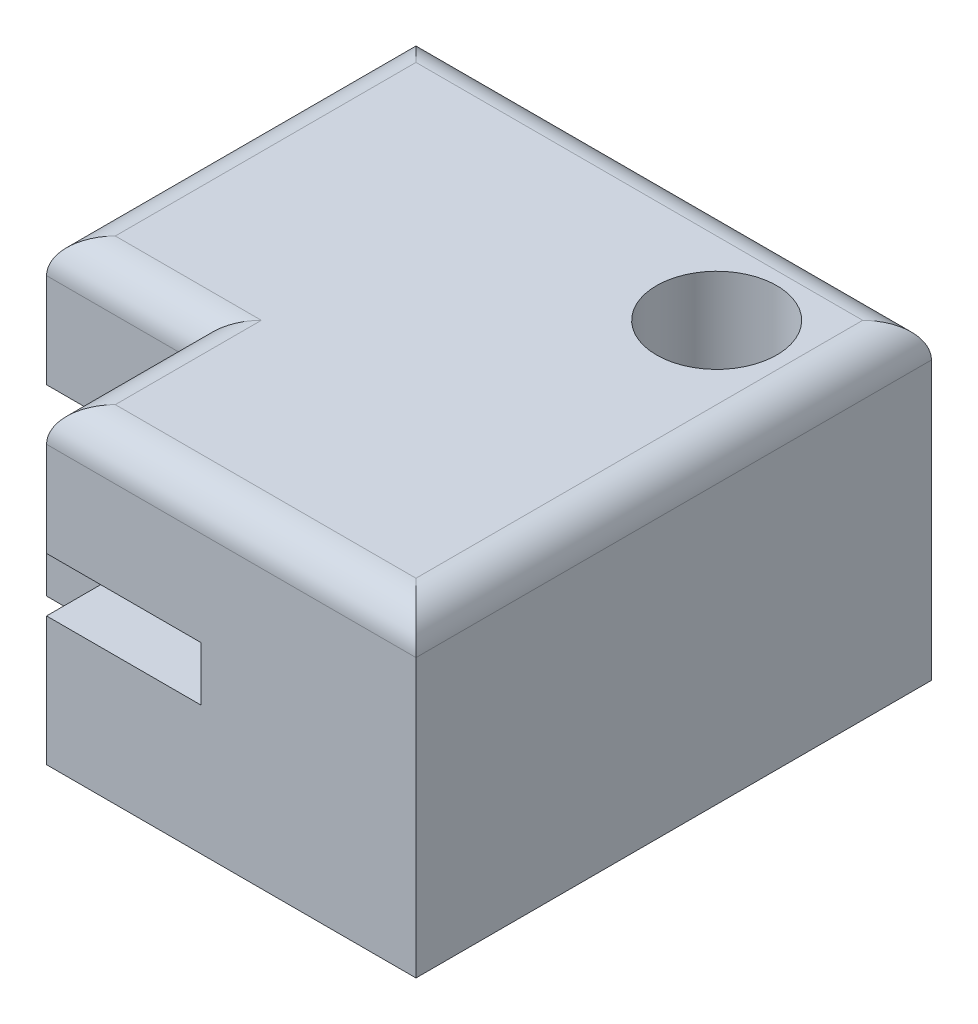
ISO-10303-21;
HEADER;
FILE_DESCRIPTION(('STEP AP214'),'2;1');
FILE_NAME('part.step','',(''),(''),'','','');
FILE_SCHEMA(('AUTOMOTIVE_DESIGN { 1 0 10303 214 1 1 1 1 }'));
ENDSEC;
DATA;
#1=APPLICATION_CONTEXT('core data for automotive mechanical design processes');
#2=APPLICATION_PROTOCOL_DEFINITION('international standard','automotive_design',2000,#1);
#3=PRODUCT_CONTEXT('',#1,'mechanical');
#4=PRODUCT('Part','Part','',(#3));
#5=PRODUCT_RELATED_PRODUCT_CATEGORY('part','',(#4));
#6=PRODUCT_DEFINITION_FORMATION('','',#4);
#7=PRODUCT_DEFINITION_CONTEXT('part definition',#1,'design');
#8=PRODUCT_DEFINITION('design','',#6,#7);
#9=PRODUCT_DEFINITION_SHAPE('','',#8);
#10=(LENGTH_UNIT() NAMED_UNIT(*) SI_UNIT(.MILLI.,.METRE.));
#11=(NAMED_UNIT(*) PLANE_ANGLE_UNIT() SI_UNIT($,.RADIAN.));
#12=(NAMED_UNIT(*) SI_UNIT($,.STERADIAN.) SOLID_ANGLE_UNIT());
#13=UNCERTAINTY_MEASURE_WITH_UNIT(LENGTH_MEASURE(1.E-05),#10,'distance_accuracy_value','');
#14=(GEOMETRIC_REPRESENTATION_CONTEXT(3) GLOBAL_UNCERTAINTY_ASSIGNED_CONTEXT((#13)) GLOBAL_UNIT_ASSIGNED_CONTEXT((#10,
#11,#12)) REPRESENTATION_CONTEXT('',''));
#15=CARTESIAN_POINT('',(0.,0.,0.));
#16=DIRECTION('',(0.,0.,1.));
#17=DIRECTION('',(1.,0.,0.));
#18=AXIS2_PLACEMENT_3D('',#15,#16,#17);
#19=CARTESIAN_POINT('',(0.,3.81,0.));
#20=DIRECTION('',(0.,-1.,0.));
#21=DIRECTION('',(0.,0.,-1.));
#22=AXIS2_PLACEMENT_3D('',#19,#20,#21);
#23=PLANE('',#22);
#24=DIRECTION('',(0.,0.,1.));
#25=VECTOR('',#24,1.);
#26=CARTESIAN_POINT('',(-7.62,3.81,7.62));
#27=LINE('',#26,#25);
#28=CARTESIAN_POINT('',(-7.62,3.81,-1.27));
#29=VERTEX_POINT('',#28);
#30=CARTESIAN_POINT('',(-7.62,3.81,3.302));
#31=VERTEX_POINT('',#30);
#32=EDGE_CURVE('E185',#29,#31,#27,.T.);
#33=ORIENTED_EDGE('',*,*,#32,.T.);
#34=DIRECTION('',(1.,0.,0.));
#35=VECTOR('',#34,1.);
#36=CARTESIAN_POINT('',(0.,3.81,3.302));
#37=LINE('',#36,#35);
#38=CARTESIAN_POINT('',(-3.302,3.81,3.302));
#39=VERTEX_POINT('',#38);
#40=EDGE_CURVE('E293',#31,#39,#37,.T.);
#41=ORIENTED_EDGE('',*,*,#40,.T.);
#42=DIRECTION('',(0.,0.,1.));
#43=VECTOR('',#42,1.);
#44=CARTESIAN_POINT('',(-3.302,3.81,0.));
#45=LINE('',#44,#43);
#46=CARTESIAN_POINT('',(-3.302,3.81,7.62));
#47=VERTEX_POINT('',#46);
#48=EDGE_CURVE('E287',#39,#47,#45,.T.);
#49=ORIENTED_EDGE('',*,*,#48,.T.);
#50=DIRECTION('',(1.,0.,0.));
#51=VECTOR('',#50,1.);
#52=CARTESIAN_POINT('',(-7.62,3.81,7.62));
#53=LINE('',#52,#51);
#54=CARTESIAN_POINT('',(1.26999999999999,3.81,7.62));
#55=VERTEX_POINT('',#54);
#56=EDGE_CURVE('E175',#47,#55,#53,.T.);
#57=ORIENTED_EDGE('',*,*,#56,.T.);
#58=DIRECTION('',(0.,0.,1.));
#59=VECTOR('',#58,1.);
#60=CARTESIAN_POINT('',(1.27,3.81,-1.27));
#61=LINE('',#60,#59);
#62=CARTESIAN_POINT('',(1.27,3.81,-1.27));
#63=VERTEX_POINT('',#62);
#64=EDGE_CURVE('E310',#63,#55,#61,.T.);
#65=ORIENTED_EDGE('',*,*,#64,.F.);
#66=DIRECTION('',(1.,0.,0.));
#67=VECTOR('',#66,1.);
#68=CARTESIAN_POINT('',(-7.62,3.81,-1.27));
#69=LINE('',#68,#67);
#70=EDGE_CURVE('E304',#29,#63,#69,.T.);
#71=ORIENTED_EDGE('',*,*,#70,.F.);
#72=EDGE_LOOP('',(#33,#41,#49,#57,#65,#71));
#73=FACE_BOUND('',#72,.T.);
#74=ADVANCED_FACE('F45',(#73),#23,.F.);
#75=CARTESIAN_POINT('',(7.62,3.81,7.62));
#76=DIRECTION('',(-1.,0.,0.));
#77=DIRECTION('',(0.,0.,1.));
#78=AXIS2_PLACEMENT_3D('',#75,#76,#77);
#79=PLANE('',#78);
#80=DIRECTION('',(0.,-1.,0.));
#81=VECTOR('',#80,1.);
#82=CARTESIAN_POINT('',(7.62,3.81,-7.62));
#83=LINE('',#82,#81);
#84=CARTESIAN_POINT('',(7.62,8.2042,-7.62));
#85=VERTEX_POINT('',#84);
#86=CARTESIAN_POINT('',(7.62,0.,-7.62));
#87=VERTEX_POINT('',#86);
#88=EDGE_CURVE('E203',#85,#87,#83,.T.);
#89=ORIENTED_EDGE('',*,*,#88,.F.);
#90=DIRECTION('',(0.,0.,-1.));
#91=VECTOR('',#90,1.);
#92=CARTESIAN_POINT('',(7.62,8.2042,7.62));
#93=LINE('',#92,#91);
#94=CARTESIAN_POINT('',(7.62,8.2042,7.62));
#95=VERTEX_POINT('',#94);
#96=EDGE_CURVE('E239',#85,#95,#93,.F.);
#97=ORIENTED_EDGE('',*,*,#96,.T.);
#98=DIRECTION('',(0.,-1.,0.));
#99=VECTOR('',#98,1.);
#100=CARTESIAN_POINT('',(7.62,3.81,7.62));
#101=LINE('',#100,#99);
#102=CARTESIAN_POINT('',(7.62,0.,7.62));
#103=VERTEX_POINT('',#102);
#104=EDGE_CURVE('E197',#95,#103,#101,.T.);
#105=ORIENTED_EDGE('',*,*,#104,.T.);
#106=DIRECTION('',(0.,0.,-1.));
#107=VECTOR('',#106,1.);
#108=CARTESIAN_POINT('',(7.62,0.,7.62));
#109=LINE('',#108,#107);
#110=EDGE_CURVE('E183',#103,#87,#109,.T.);
#111=ORIENTED_EDGE('',*,*,#110,.T.);
#112=EDGE_LOOP('',(#89,#97,#105,#111));
#113=FACE_BOUND('',#112,.T.);
#114=ADVANCED_FACE('F365',(#113),#79,.F.);
#115=CARTESIAN_POINT('',(-7.62,3.81,-7.62));
#116=DIRECTION('',(0.,0.,1.));
#117=DIRECTION('',(1.,0.,0.));
#118=AXIS2_PLACEMENT_3D('',#115,#116,#117);
#119=PLANE('',#118);
#120=DIRECTION('',(0.,-1.,0.));
#121=VECTOR('',#120,1.);
#122=CARTESIAN_POINT('',(-7.62,3.81,-7.62));
#123=LINE('',#122,#121);
#124=CARTESIAN_POINT('',(-7.62,8.2042,-7.62));
#125=VERTEX_POINT('',#124);
#126=CARTESIAN_POINT('',(-7.62,0.,-7.62));
#127=VERTEX_POINT('',#126);
#128=EDGE_CURVE('E200',#125,#127,#123,.T.);
#129=ORIENTED_EDGE('',*,*,#128,.F.);
#130=DIRECTION('',(-1.,0.,0.));
#131=VECTOR('',#130,1.);
#132=CARTESIAN_POINT('',(-7.62,8.2042,-7.62));
#133=LINE('',#132,#131);
#134=EDGE_CURVE('E236',#125,#85,#133,.F.);
#135=ORIENTED_EDGE('',*,*,#134,.T.);
#136=ORIENTED_EDGE('',*,*,#88,.T.);
#137=DIRECTION('',(-1.,0.,0.));
#138=VECTOR('',#137,1.);
#139=CARTESIAN_POINT('',(-7.62,0.,-7.62));
#140=LINE('',#139,#138);
#141=EDGE_CURVE('E193',#87,#127,#140,.T.);
#142=ORIENTED_EDGE('',*,*,#141,.T.);
#143=EDGE_LOOP('',(#129,#135,#136,#142));
#144=FACE_BOUND('',#143,.T.);
#145=ADVANCED_FACE('F339',(#144),#119,.F.);
#146=CARTESIAN_POINT('',(-7.62,3.81,7.62));
#147=DIRECTION('',(1.,0.,0.));
#148=DIRECTION('',(0.,0.,-1.));
#149=AXIS2_PLACEMENT_3D('',#146,#147,#148);
#150=PLANE('',#149);
#151=DIRECTION('',(0.,1.,0.));
#152=VECTOR('',#151,1.);
#153=CARTESIAN_POINT('',(-7.62,0.,3.302));
#154=LINE('',#153,#152);
#155=CARTESIAN_POINT('',(-7.62,5.4102,3.302));
#156=VERTEX_POINT('',#155);
#157=CARTESIAN_POINT('',(-7.62,8.2042,3.302));
#158=VERTEX_POINT('',#157);
#159=EDGE_CURVE('E288',#156,#158,#154,.T.);
#160=ORIENTED_EDGE('',*,*,#159,.T.);
#161=DIRECTION('',(0.,0.,1.));
#162=VECTOR('',#161,1.);
#163=CARTESIAN_POINT('',(-7.62,8.2042,7.62));
#164=LINE('',#163,#162);
#165=EDGE_CURVE('E232',#158,#125,#164,.F.);
#166=ORIENTED_EDGE('',*,*,#165,.T.);
#167=ORIENTED_EDGE('',*,*,#128,.T.);
#168=DIRECTION('',(0.,0.,1.));
#169=VECTOR('',#168,1.);
#170=CARTESIAN_POINT('',(-7.62,0.,7.62));
#171=LINE('',#170,#169);
#172=CARTESIAN_POINT('',(-7.62,0.,3.302));
#173=VERTEX_POINT('',#172);
#174=EDGE_CURVE('E186',#127,#173,#171,.T.);
#175=ORIENTED_EDGE('',*,*,#174,.T.);
#176=EDGE_CURVE('E283',#173,#31,#154,.T.);
#177=ORIENTED_EDGE('',*,*,#176,.T.);
#178=ORIENTED_EDGE('',*,*,#32,.F.);
#179=DIRECTION('',(0.,-1.,0.));
#180=VECTOR('',#179,1.);
#181=CARTESIAN_POINT('',(-7.62,5.4102,-1.27));
#182=LINE('',#181,#180);
#183=CARTESIAN_POINT('',(-7.62,5.4102,-1.27));
#184=VERTEX_POINT('',#183);
#185=EDGE_CURVE('E327',#184,#29,#182,.T.);
#186=ORIENTED_EDGE('',*,*,#185,.F.);
#187=DIRECTION('',(0.,0.,1.));
#188=VECTOR('',#187,1.);
#189=CARTESIAN_POINT('',(-7.62,5.4102,7.62));
#190=LINE('',#189,#188);
#191=EDGE_CURVE('E297',#184,#156,#190,.T.);
#192=ORIENTED_EDGE('',*,*,#191,.T.);
#193=EDGE_LOOP('',(#160,#166,#167,#175,#177,#178,#186,#192));
#194=FACE_BOUND('',#193,.T.);
#195=ADVANCED_FACE('F343',(#194),#150,.F.);
#196=CARTESIAN_POINT('',(-7.62,3.81,7.62));
#197=DIRECTION('',(0.,0.,-1.));
#198=DIRECTION('',(-1.,0.,0.));
#199=AXIS2_PLACEMENT_3D('',#196,#197,#198);
#200=PLANE('',#199);
#201=ORIENTED_EDGE('',*,*,#104,.F.);
#202=DIRECTION('',(1.,0.,0.));
#203=VECTOR('',#202,1.);
#204=CARTESIAN_POINT('',(-7.62,8.2042,7.62));
#205=LINE('',#204,#203);
#206=CARTESIAN_POINT('',(-3.302,8.2042,7.62));
#207=VERTEX_POINT('',#206);
#208=EDGE_CURVE('E70',#95,#207,#205,.F.);
#209=ORIENTED_EDGE('',*,*,#208,.T.);
#210=DIRECTION('',(0.,1.,0.));
#211=VECTOR('',#210,1.);
#212=CARTESIAN_POINT('',(-3.302,0.,7.62));
#213=LINE('',#212,#211);
#214=CARTESIAN_POINT('',(-3.302,5.4102,7.62));
#215=VERTEX_POINT('',#214);
#216=EDGE_CURVE('E178',#215,#207,#213,.T.);
#217=ORIENTED_EDGE('',*,*,#216,.F.);
#218=DIRECTION('',(1.,0.,0.));
#219=VECTOR('',#218,1.);
#220=CARTESIAN_POINT('',(-7.62,5.4102,7.62));
#221=LINE('',#220,#219);
#222=CARTESIAN_POINT('',(1.26999999999999,5.4102,7.62));
#223=VERTEX_POINT('',#222);
#224=EDGE_CURVE('E301',#215,#223,#221,.T.);
#225=ORIENTED_EDGE('',*,*,#224,.T.);
#226=DIRECTION('',(0.,-1.,0.));
#227=VECTOR('',#226,1.);
#228=CARTESIAN_POINT('',(1.27,5.4102,7.62));
#229=LINE('',#228,#227);
#230=EDGE_CURVE('E314',#223,#55,#229,.T.);
#231=ORIENTED_EDGE('',*,*,#230,.T.);
#232=ORIENTED_EDGE('',*,*,#56,.F.);
#233=CARTESIAN_POINT('',(-3.302,0.,7.62));
#234=VERTEX_POINT('',#233);
#235=EDGE_CURVE('E158',#234,#47,#213,.T.);
#236=ORIENTED_EDGE('',*,*,#235,.F.);
#237=DIRECTION('',(1.,0.,0.));
#238=VECTOR('',#237,1.);
#239=CARTESIAN_POINT('',(-7.62,0.,7.62));
#240=LINE('',#239,#238);
#241=EDGE_CURVE('E172',#234,#103,#240,.T.);
#242=ORIENTED_EDGE('',*,*,#241,.T.);
#243=EDGE_LOOP('',(#201,#209,#217,#225,#231,#232,#236,#242));
#244=FACE_BOUND('',#243,.T.);
#245=ADVANCED_FACE('F171',(#244),#200,.F.);
#246=CARTESIAN_POINT('',(0.,0.,0.));
#247=DIRECTION('',(0.,-1.,0.));
#248=DIRECTION('',(0.,0.,-1.));
#249=AXIS2_PLACEMENT_3D('',#246,#247,#248);
#250=PLANE('',#249);
#251=CARTESIAN_POINT('',(4.445,0.,-4.445));
#252=DIRECTION('',(0.,1.,0.));
#253=DIRECTION('',(0.,0.,1.));
#254=AXIS2_PLACEMENT_3D('',#251,#252,#253);
#255=CIRCLE('',#254,1.778);
#256=CARTESIAN_POINT('',(4.445,0.,-2.667));
#257=VERTEX_POINT('',#256);
#258=EDGE_CURVE('E167',#257,#257,#255,.T.);
#259=ORIENTED_EDGE('',*,*,#258,.T.);
#260=EDGE_LOOP('',(#259));
#261=FACE_BOUND('',#260,.T.);
#262=DIRECTION('',(-1.,0.,0.));
#263=VECTOR('',#262,1.);
#264=CARTESIAN_POINT('',(-7.62,0.,3.302));
#265=LINE('',#264,#263);
#266=CARTESIAN_POINT('',(-3.302,0.,3.302));
#267=VERTEX_POINT('',#266);
#268=EDGE_CURVE('E166',#267,#173,#265,.T.);
#269=ORIENTED_EDGE('',*,*,#268,.T.);
#270=ORIENTED_EDGE('',*,*,#174,.F.);
#271=ORIENTED_EDGE('',*,*,#141,.F.);
#272=ORIENTED_EDGE('',*,*,#110,.F.);
#273=ORIENTED_EDGE('',*,*,#241,.F.);
#274=DIRECTION('',(0.,0.,-1.));
#275=VECTOR('',#274,1.);
#276=CARTESIAN_POINT('',(-3.302,0.,7.62));
#277=LINE('',#276,#275);
#278=EDGE_CURVE('E155',#234,#267,#277,.T.);
#279=ORIENTED_EDGE('',*,*,#278,.T.);
#280=EDGE_LOOP('',(#269,#270,#271,#272,#273,#279));
#281=FACE_BOUND('',#280,.T.);
#282=ADVANCED_FACE('F180',(#261,#281),#250,.T.);
#283=CARTESIAN_POINT('',(-7.62,5.4102,-1.27));
#284=DIRECTION('',(0.,0.,-1.));
#285=DIRECTION('',(-1.,0.,0.));
#286=AXIS2_PLACEMENT_3D('',#283,#284,#285);
#287=PLANE('',#286);
#288=ORIENTED_EDGE('',*,*,#70,.T.);
#289=DIRECTION('',(0.,-1.,0.));
#290=VECTOR('',#289,1.);
#291=CARTESIAN_POINT('',(1.27,5.4102,-1.27));
#292=LINE('',#291,#290);
#293=CARTESIAN_POINT('',(1.27,5.4102,-1.27));
#294=VERTEX_POINT('',#293);
#295=EDGE_CURVE('E323',#294,#63,#292,.T.);
#296=ORIENTED_EDGE('',*,*,#295,.F.);
#297=DIRECTION('',(1.,0.,0.));
#298=VECTOR('',#297,1.);
#299=CARTESIAN_POINT('',(-7.62,5.4102,-1.27));
#300=LINE('',#299,#298);
#301=EDGE_CURVE('E305',#184,#294,#300,.T.);
#302=ORIENTED_EDGE('',*,*,#301,.F.);
#303=ORIENTED_EDGE('',*,*,#185,.T.);
#304=EDGE_LOOP('',(#288,#296,#302,#303));
#305=FACE_BOUND('',#304,.T.);
#306=ADVANCED_FACE('F387',(#305),#287,.F.);
#307=CARTESIAN_POINT('',(1.27,5.4102,-1.27));
#308=DIRECTION('',(1.,0.,0.));
#309=DIRECTION('',(0.,0.,-1.));
#310=AXIS2_PLACEMENT_3D('',#307,#308,#309);
#311=PLANE('',#310);
#312=ORIENTED_EDGE('',*,*,#64,.T.);
#313=ORIENTED_EDGE('',*,*,#230,.F.);
#314=DIRECTION('',(0.,0.,1.));
#315=VECTOR('',#314,1.);
#316=CARTESIAN_POINT('',(1.27,5.4102,-1.27));
#317=LINE('',#316,#315);
#318=EDGE_CURVE('E309',#294,#223,#317,.T.);
#319=ORIENTED_EDGE('',*,*,#318,.F.);
#320=ORIENTED_EDGE('',*,*,#295,.T.);
#321=EDGE_LOOP('',(#312,#313,#319,#320));
#322=FACE_BOUND('',#321,.T.);
#323=ADVANCED_FACE('F488',(#322),#311,.F.);
#324=CARTESIAN_POINT('',(0.,9.2202,0.));
#325=DIRECTION('',(0.,-1.,0.));
#326=DIRECTION('',(0.,0.,-1.));
#327=AXIS2_PLACEMENT_3D('',#324,#325,#326);
#328=PLANE('',#327);
#329=DIRECTION('',(-1.,0.,0.));
#330=VECTOR('',#329,1.);
#331=CARTESIAN_POINT('',(0.,9.2202,-6.604));
#332=LINE('',#331,#330);
#333=CARTESIAN_POINT('',(6.604,9.2202,-6.604));
#334=VERTEX_POINT('',#333);
#335=CARTESIAN_POINT('',(-6.604,9.2202,-6.604));
#336=VERTEX_POINT('',#335);
#337=EDGE_CURVE('E225',#334,#336,#332,.T.);
#338=ORIENTED_EDGE('',*,*,#337,.T.);
#339=DIRECTION('',(0.,0.,1.));
#340=VECTOR('',#339,1.);
#341=CARTESIAN_POINT('',(-6.604,9.2202,0.));
#342=LINE('',#341,#340);
#343=CARTESIAN_POINT('',(-6.604,9.2202,2.286));
#344=VERTEX_POINT('',#343);
#345=EDGE_CURVE('E228',#336,#344,#342,.T.);
#346=ORIENTED_EDGE('',*,*,#345,.T.);
#347=DIRECTION('',(-1.,0.,0.));
#348=VECTOR('',#347,1.);
#349=CARTESIAN_POINT('',(0.,9.2202,2.286));
#350=LINE('',#349,#348);
#351=CARTESIAN_POINT('',(-2.286,9.2202,2.286));
#352=VERTEX_POINT('',#351);
#353=EDGE_CURVE('E213',#344,#352,#350,.F.);
#354=ORIENTED_EDGE('',*,*,#353,.T.);
#355=DIRECTION('',(0.,0.,-1.));
#356=VECTOR('',#355,1.);
#357=CARTESIAN_POINT('',(-2.286,9.2202,0.));
#358=LINE('',#357,#356);
#359=CARTESIAN_POINT('',(-2.286,9.2202,6.604));
#360=VERTEX_POINT('',#359);
#361=EDGE_CURVE('E216',#352,#360,#358,.F.);
#362=ORIENTED_EDGE('',*,*,#361,.T.);
#363=DIRECTION('',(1.,0.,0.));
#364=VECTOR('',#363,1.);
#365=CARTESIAN_POINT('',(0.,9.2202,6.604));
#366=LINE('',#365,#364);
#367=CARTESIAN_POINT('',(6.604,9.2202,6.604));
#368=VERTEX_POINT('',#367);
#369=EDGE_CURVE('E219',#360,#368,#366,.T.);
#370=ORIENTED_EDGE('',*,*,#369,.T.);
#371=DIRECTION('',(0.,0.,-1.));
#372=VECTOR('',#371,1.);
#373=CARTESIAN_POINT('',(6.604,9.2202,0.));
#374=LINE('',#373,#372);
#375=EDGE_CURVE('E222',#368,#334,#374,.T.);
#376=ORIENTED_EDGE('',*,*,#375,.T.);
#377=EDGE_LOOP('',(#338,#346,#354,#362,#370,#376));
#378=FACE_BOUND('',#377,.T.);
#379=CARTESIAN_POINT('',(4.445,9.2202,-4.445));
#380=DIRECTION('',(0.,1.,0.));
#381=DIRECTION('',(0.,0.,1.));
#382=AXIS2_PLACEMENT_3D('',#379,#380,#381);
#383=CIRCLE('',#382,1.778);
#384=CARTESIAN_POINT('',(4.445,9.2202,-2.667));
#385=VERTEX_POINT('',#384);
#386=EDGE_CURVE('E267',#385,#385,#383,.T.);
#387=ORIENTED_EDGE('',*,*,#386,.F.);
#388=EDGE_LOOP('',(#387));
#389=FACE_BOUND('',#388,.T.);
#390=ADVANCED_FACE('F358',(#378,#389),#328,.F.);
#391=CARTESIAN_POINT('',(0.,5.4102,0.));
#392=DIRECTION('',(0.,-1.,0.));
#393=DIRECTION('',(0.,0.,-1.));
#394=AXIS2_PLACEMENT_3D('',#391,#392,#393);
#395=PLANE('',#394);
#396=DIRECTION('',(1.,0.,0.));
#397=VECTOR('',#396,1.);
#398=CARTESIAN_POINT('',(0.,5.4102,3.302));
#399=LINE('',#398,#397);
#400=CARTESIAN_POINT('',(-3.302,5.4102,3.302));
#401=VERTEX_POINT('',#400);
#402=EDGE_CURVE('E209',#156,#401,#399,.T.);
#403=ORIENTED_EDGE('',*,*,#402,.F.);
#404=ORIENTED_EDGE('',*,*,#191,.F.);
#405=ORIENTED_EDGE('',*,*,#301,.T.);
#406=ORIENTED_EDGE('',*,*,#318,.T.);
#407=ORIENTED_EDGE('',*,*,#224,.F.);
#408=DIRECTION('',(0.,0.,1.));
#409=VECTOR('',#408,1.);
#410=CARTESIAN_POINT('',(-3.302,5.4102,0.));
#411=LINE('',#410,#409);
#412=EDGE_CURVE('E206',#401,#215,#411,.T.);
#413=ORIENTED_EDGE('',*,*,#412,.F.);
#414=EDGE_LOOP('',(#403,#404,#405,#406,#407,#413));
#415=FACE_BOUND('',#414,.T.);
#416=ADVANCED_FACE('F474',(#415),#395,.T.);
#417=CARTESIAN_POINT('',(-3.302,0.,7.62));
#418=DIRECTION('',(1.,0.,0.));
#419=DIRECTION('',(0.,0.,-1.));
#420=AXIS2_PLACEMENT_3D('',#417,#418,#419);
#421=PLANE('',#420);
#422=ORIENTED_EDGE('',*,*,#216,.T.);
#423=DIRECTION('',(0.,0.,-1.));
#424=VECTOR('',#423,1.);
#425=CARTESIAN_POINT('',(-3.302,8.2042,7.62));
#426=LINE('',#425,#424);
#427=CARTESIAN_POINT('',(-3.302,8.2042,3.302));
#428=VERTEX_POINT('',#427);
#429=EDGE_CURVE('E55',#207,#428,#426,.T.);
#430=ORIENTED_EDGE('',*,*,#429,.T.);
#431=DIRECTION('',(0.,1.,0.));
#432=VECTOR('',#431,1.);
#433=CARTESIAN_POINT('',(-3.302,0.,3.302));
#434=LINE('',#433,#432);
#435=EDGE_CURVE('E177',#401,#428,#434,.T.);
#436=ORIENTED_EDGE('',*,*,#435,.F.);
#437=ORIENTED_EDGE('',*,*,#412,.T.);
#438=EDGE_LOOP('',(#422,#430,#436,#437));
#439=FACE_BOUND('',#438,.T.);
#440=ADVANCED_FACE('F451',(#439),#421,.F.);
#441=CARTESIAN_POINT('',(-7.62,0.,3.302));
#442=DIRECTION('',(0.,0.,-1.));
#443=DIRECTION('',(-1.,0.,0.));
#444=AXIS2_PLACEMENT_3D('',#441,#442,#443);
#445=PLANE('',#444);
#446=ORIENTED_EDGE('',*,*,#435,.T.);
#447=DIRECTION('',(-1.,0.,0.));
#448=VECTOR('',#447,1.);
#449=CARTESIAN_POINT('',(-7.62,8.2042,3.302));
#450=LINE('',#449,#448);
#451=EDGE_CURVE('E11',#428,#158,#450,.T.);
#452=ORIENTED_EDGE('',*,*,#451,.T.);
#453=ORIENTED_EDGE('',*,*,#159,.F.);
#454=ORIENTED_EDGE('',*,*,#402,.T.);
#455=EDGE_LOOP('',(#446,#452,#453,#454));
#456=FACE_BOUND('',#455,.T.);
#457=ADVANCED_FACE('F458',(#456),#445,.F.);
#458=ORIENTED_EDGE('',*,*,#176,.F.);
#459=ORIENTED_EDGE('',*,*,#268,.F.);
#460=EDGE_CURVE('E161',#267,#39,#434,.T.);
#461=ORIENTED_EDGE('',*,*,#460,.T.);
#462=ORIENTED_EDGE('',*,*,#40,.F.);
#463=EDGE_LOOP('',(#458,#459,#461,#462));
#464=FACE_BOUND('',#463,.T.);
#465=ADVANCED_FACE('F449',(#464),#445,.F.);
#466=ORIENTED_EDGE('',*,*,#460,.F.);
#467=ORIENTED_EDGE('',*,*,#278,.F.);
#468=ORIENTED_EDGE('',*,*,#235,.T.);
#469=ORIENTED_EDGE('',*,*,#48,.F.);
#470=EDGE_LOOP('',(#466,#467,#468,#469));
#471=FACE_BOUND('',#470,.T.);
#472=ADVANCED_FACE('F157',(#471),#421,.F.);
#473=CARTESIAN_POINT('',(4.445,0.,-4.445));
#474=DIRECTION('',(0.,1.,0.));
#475=DIRECTION('',(0.,0.,1.));
#476=AXIS2_PLACEMENT_3D('',#473,#474,#475);
#477=CYLINDRICAL_SURFACE('',#476,1.778);
#478=ORIENTED_EDGE('',*,*,#258,.F.);
#479=EDGE_LOOP('',(#478));
#480=FACE_BOUND('',#479,.T.);
#481=ORIENTED_EDGE('',*,*,#386,.T.);
#482=EDGE_LOOP('',(#481));
#483=FACE_BOUND('',#482,.T.);
#484=ADVANCED_FACE('F374',(#480,#483),#477,.F.);
#485=CARTESIAN_POINT('',(0.,8.2042,6.604));
#486=DIRECTION('',(1.,0.,0.));
#487=DIRECTION('',(0.,0.,-1.));
#488=AXIS2_PLACEMENT_3D('',#485,#486,#487);
#489=CYLINDRICAL_SURFACE('',#488,1.016);
#490=CARTESIAN_POINT('',(-2.286,8.2042,6.604));
#491=DIRECTION('',(-0.707106781186547,0.,-0.707106781186547));
#492=DIRECTION('',(0.707106781186547,0.,-0.707106781186547));
#493=AXIS2_PLACEMENT_3D('',#490,#491,#492);
#494=ELLIPSE('',#493,1.43684097937106,1.016);
#495=EDGE_CURVE('E259',#207,#360,#494,.T.);
#496=ORIENTED_EDGE('',*,*,#495,.F.);
#497=ORIENTED_EDGE('',*,*,#208,.F.);
#498=CARTESIAN_POINT('',(6.604,8.2042,6.604));
#499=DIRECTION('',(0.707106781186547,0.,-0.707106781186547));
#500=DIRECTION('',(0.707106781186547,0.,0.707106781186547));
#501=AXIS2_PLACEMENT_3D('',#498,#499,#500);
#502=ELLIPSE('',#501,1.43684097937106,1.016);
#503=EDGE_CURVE('E49',#368,#95,#502,.T.);
#504=ORIENTED_EDGE('',*,*,#503,.F.);
#505=ORIENTED_EDGE('',*,*,#369,.F.);
#506=EDGE_LOOP('',(#496,#497,#504,#505));
#507=FACE_BOUND('',#506,.T.);
#508=ADVANCED_FACE('F47',(#507),#489,.T.);
#509=CARTESIAN_POINT('',(6.604,8.2042,0.));
#510=DIRECTION('',(0.,0.,-1.));
#511=DIRECTION('',(-1.,0.,0.));
#512=AXIS2_PLACEMENT_3D('',#509,#510,#511);
#513=CYLINDRICAL_SURFACE('',#512,1.016);
#514=ORIENTED_EDGE('',*,*,#503,.T.);
#515=ORIENTED_EDGE('',*,*,#96,.F.);
#516=CARTESIAN_POINT('',(6.604,8.2042,-6.604));
#517=DIRECTION('',(-0.707106781186547,0.,-0.707106781186547));
#518=DIRECTION('',(0.707106781186547,0.,-0.707106781186547));
#519=AXIS2_PLACEMENT_3D('',#516,#517,#518);
#520=ELLIPSE('',#519,1.43684097937106,1.016);
#521=EDGE_CURVE('E256',#334,#85,#520,.T.);
#522=ORIENTED_EDGE('',*,*,#521,.F.);
#523=ORIENTED_EDGE('',*,*,#375,.F.);
#524=EDGE_LOOP('',(#514,#515,#522,#523));
#525=FACE_BOUND('',#524,.T.);
#526=ADVANCED_FACE('F366',(#525),#513,.T.);
#527=CARTESIAN_POINT('',(-2.286,8.2042,7.62));
#528=DIRECTION('',(0.,0.,-1.));
#529=DIRECTION('',(-1.,0.,0.));
#530=AXIS2_PLACEMENT_3D('',#527,#528,#529);
#531=CYLINDRICAL_SURFACE('',#530,1.016);
#532=ORIENTED_EDGE('',*,*,#495,.T.);
#533=ORIENTED_EDGE('',*,*,#361,.F.);
#534=CARTESIAN_POINT('',(-2.286,8.2042,2.286));
#535=DIRECTION('',(-0.707106781186547,0.,-0.707106781186547));
#536=DIRECTION('',(0.707106781186547,0.,-0.707106781186547));
#537=AXIS2_PLACEMENT_3D('',#534,#535,#536);
#538=ELLIPSE('',#537,1.43684097937106,1.016);
#539=EDGE_CURVE('E252',#428,#352,#538,.T.);
#540=ORIENTED_EDGE('',*,*,#539,.F.);
#541=ORIENTED_EDGE('',*,*,#429,.F.);
#542=EDGE_LOOP('',(#532,#533,#540,#541));
#543=FACE_BOUND('',#542,.T.);
#544=ADVANCED_FACE('F368',(#543),#531,.T.);
#545=CARTESIAN_POINT('',(0.,8.2042,-6.604));
#546=DIRECTION('',(-1.,0.,0.));
#547=DIRECTION('',(0.,0.,1.));
#548=AXIS2_PLACEMENT_3D('',#545,#546,#547);
#549=CYLINDRICAL_SURFACE('',#548,1.016);
#550=ORIENTED_EDGE('',*,*,#521,.T.);
#551=ORIENTED_EDGE('',*,*,#134,.F.);
#552=CARTESIAN_POINT('',(-6.604,8.2042,-6.604));
#553=DIRECTION('',(-0.707106781186547,0.,0.707106781186547));
#554=DIRECTION('',(-0.707106781186547,0.,-0.707106781186547));
#555=AXIS2_PLACEMENT_3D('',#552,#553,#554);
#556=ELLIPSE('',#555,1.43684097937106,1.016);
#557=EDGE_CURVE('E249',#336,#125,#556,.T.);
#558=ORIENTED_EDGE('',*,*,#557,.F.);
#559=ORIENTED_EDGE('',*,*,#337,.F.);
#560=EDGE_LOOP('',(#550,#551,#558,#559));
#561=FACE_BOUND('',#560,.T.);
#562=ADVANCED_FACE('F363',(#561),#549,.T.);
#563=CARTESIAN_POINT('',(-7.62,8.2042,2.286));
#564=DIRECTION('',(-1.,0.,0.));
#565=DIRECTION('',(0.,0.,1.));
#566=AXIS2_PLACEMENT_3D('',#563,#564,#565);
#567=CYLINDRICAL_SURFACE('',#566,1.016);
#568=ORIENTED_EDGE('',*,*,#539,.T.);
#569=ORIENTED_EDGE('',*,*,#353,.F.);
#570=CARTESIAN_POINT('',(-6.604,8.2042,2.286));
#571=DIRECTION('',(-0.707106781186547,0.,-0.707106781186547));
#572=DIRECTION('',(-0.707106781186547,0.,0.707106781186547));
#573=AXIS2_PLACEMENT_3D('',#570,#571,#572);
#574=ELLIPSE('',#573,1.43684097937106,1.016);
#575=EDGE_CURVE('E246',#158,#344,#574,.T.);
#576=ORIENTED_EDGE('',*,*,#575,.F.);
#577=ORIENTED_EDGE('',*,*,#451,.F.);
#578=EDGE_LOOP('',(#568,#569,#576,#577));
#579=FACE_BOUND('',#578,.T.);
#580=ADVANCED_FACE('F355',(#579),#567,.T.);
#581=CARTESIAN_POINT('',(-6.604,8.2042,0.));
#582=DIRECTION('',(0.,0.,1.));
#583=DIRECTION('',(1.,0.,0.));
#584=AXIS2_PLACEMENT_3D('',#581,#582,#583);
#585=CYLINDRICAL_SURFACE('',#584,1.016);
#586=ORIENTED_EDGE('',*,*,#557,.T.);
#587=ORIENTED_EDGE('',*,*,#165,.F.);
#588=ORIENTED_EDGE('',*,*,#575,.T.);
#589=ORIENTED_EDGE('',*,*,#345,.F.);
#590=EDGE_LOOP('',(#586,#587,#588,#589));
#591=FACE_BOUND('',#590,.T.);
#592=ADVANCED_FACE('F348',(#591),#585,.T.);
#593=CLOSED_SHELL('',(#74,#114,#145,#195,#245,#282,#306,#323,#390,#416,#440,#457,#465,#472,#484,
#508,#526,#544,#562,#580,#592));
#594=MANIFOLD_SOLID_BREP('B2',#593);
#595=ADVANCED_BREP_SHAPE_REPRESENTATION('',(#18,#594),#14);
#596=SHAPE_DEFINITION_REPRESENTATION(#9,#595);
ENDSEC;
END-ISO-10303-21;
